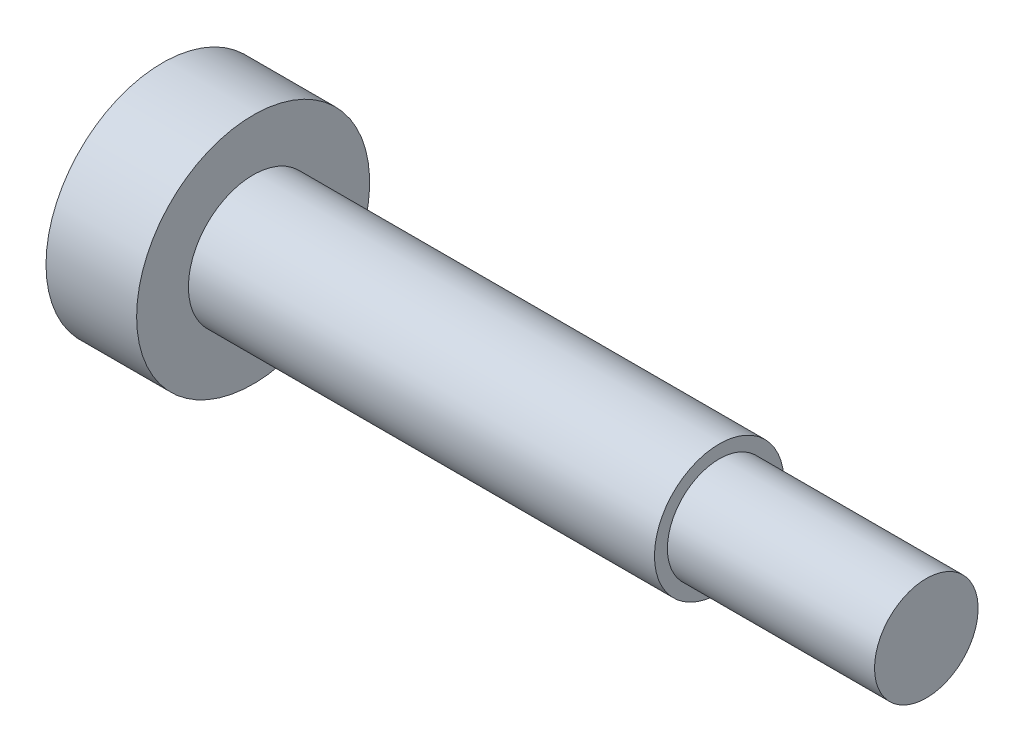
ISO-10303-21;
HEADER;
FILE_DESCRIPTION(('STEP AP214'),'2;1');
FILE_NAME('part.step','',(''),(''),'','','');
FILE_SCHEMA(('AUTOMOTIVE_DESIGN { 1 0 10303 214 1 1 1 1 }'));
ENDSEC;
DATA;
#1=APPLICATION_CONTEXT('core data for automotive mechanical design processes');
#2=APPLICATION_PROTOCOL_DEFINITION('international standard','automotive_design',2000,#1);
#3=PRODUCT_CONTEXT('',#1,'mechanical');
#4=PRODUCT('Part','Part','',(#3));
#5=PRODUCT_RELATED_PRODUCT_CATEGORY('part','',(#4));
#6=PRODUCT_DEFINITION_FORMATION('','',#4);
#7=PRODUCT_DEFINITION_CONTEXT('part definition',#1,'design');
#8=PRODUCT_DEFINITION('design','',#6,#7);
#9=PRODUCT_DEFINITION_SHAPE('','',#8);
#10=(LENGTH_UNIT() NAMED_UNIT(*) SI_UNIT(.MILLI.,.METRE.));
#11=(NAMED_UNIT(*) PLANE_ANGLE_UNIT() SI_UNIT($,.RADIAN.));
#12=(NAMED_UNIT(*) SI_UNIT($,.STERADIAN.) SOLID_ANGLE_UNIT());
#13=UNCERTAINTY_MEASURE_WITH_UNIT(LENGTH_MEASURE(1.E-05),#10,'distance_accuracy_value','');
#14=(GEOMETRIC_REPRESENTATION_CONTEXT(3) GLOBAL_UNCERTAINTY_ASSIGNED_CONTEXT((#13)) GLOBAL_UNIT_ASSIGNED_CONTEXT((#10,
#11,#12)) REPRESENTATION_CONTEXT('',''));
#15=CARTESIAN_POINT('',(0.,0.,0.));
#16=DIRECTION('',(0.,0.,1.));
#17=DIRECTION('',(1.,0.,0.));
#18=AXIS2_PLACEMENT_3D('',#15,#16,#17);
#19=CARTESIAN_POINT('',(0.,0.,0.));
#20=DIRECTION('',(-1.,0.,0.));
#21=DIRECTION('',(0.,0.,1.));
#22=AXIS2_PLACEMENT_3D('',#19,#20,#21);
#23=PLANE('',#22);
#24=CARTESIAN_POINT('',(0.,0.,0.));
#25=DIRECTION('',(-1.,0.,0.));
#26=DIRECTION('',(0.,0.,1.));
#27=AXIS2_PLACEMENT_3D('',#24,#25,#26);
#28=CIRCLE('',#27,2.);
#29=CARTESIAN_POINT('',(0.,0.,2.));
#30=VERTEX_POINT('',#29);
#31=EDGE_CURVE('E10',#30,#30,#28,.T.);
#32=ORIENTED_EDGE('',*,*,#31,.F.);
#33=EDGE_LOOP('',(#32));
#34=FACE_BOUND('',#33,.T.);
#35=ADVANCED_FACE('F39',(#34),#23,.F.);
#36=CARTESIAN_POINT('',(-29.5,0.,0.));
#37=DIRECTION('',(-1.,0.,0.));
#38=DIRECTION('',(0.,0.,1.));
#39=AXIS2_PLACEMENT_3D('',#36,#37,#38);
#40=CYLINDRICAL_SURFACE('',#39,2.);
#41=CARTESIAN_POINT('',(-8.,0.,0.));
#42=DIRECTION('',(-1.,0.,0.));
#43=DIRECTION('',(0.,0.,1.));
#44=AXIS2_PLACEMENT_3D('',#41,#42,#43);
#45=CIRCLE('',#44,2.);
#46=CARTESIAN_POINT('',(-8.,0.,2.));
#47=VERTEX_POINT('',#46);
#48=EDGE_CURVE('E45',#47,#47,#45,.T.);
#49=ORIENTED_EDGE('',*,*,#48,.F.);
#50=EDGE_LOOP('',(#49));
#51=FACE_BOUND('',#50,.T.);
#52=ORIENTED_EDGE('',*,*,#31,.T.);
#53=EDGE_LOOP('',(#52));
#54=FACE_BOUND('',#53,.T.);
#55=ADVANCED_FACE('F87',(#51,#54),#40,.T.);
#56=CARTESIAN_POINT('',(-8.,0.,-2.));
#57=DIRECTION('',(-1.,0.,0.));
#58=DIRECTION('',(0.,0.,1.));
#59=AXIS2_PLACEMENT_3D('',#56,#57,#58);
#60=PLANE('',#59);
#61=CARTESIAN_POINT('',(-8.,0.,0.));
#62=DIRECTION('',(-1.,0.,0.));
#63=DIRECTION('',(0.,0.,1.));
#64=AXIS2_PLACEMENT_3D('',#61,#62,#63);
#65=CIRCLE('',#64,2.5);
#66=CARTESIAN_POINT('',(-8.,0.,2.5));
#67=VERTEX_POINT('',#66);
#68=EDGE_CURVE('E49',#67,#67,#65,.T.);
#69=ORIENTED_EDGE('',*,*,#68,.F.);
#70=EDGE_LOOP('',(#69));
#71=FACE_BOUND('',#70,.T.);
#72=ORIENTED_EDGE('',*,*,#48,.T.);
#73=EDGE_LOOP('',(#72));
#74=FACE_BOUND('',#73,.T.);
#75=ADVANCED_FACE('F82',(#71,#74),#60,.F.);
#76=CARTESIAN_POINT('',(-29.5,0.,0.));
#77=DIRECTION('',(-1.,0.,0.));
#78=DIRECTION('',(0.,0.,1.));
#79=AXIS2_PLACEMENT_3D('',#76,#77,#78);
#80=CYLINDRICAL_SURFACE('',#79,2.5);
#81=CARTESIAN_POINT('',(-26.,0.,0.));
#82=DIRECTION('',(-1.,0.,0.));
#83=DIRECTION('',(0.,0.,1.));
#84=AXIS2_PLACEMENT_3D('',#81,#82,#83);
#85=CIRCLE('',#84,2.5);
#86=CARTESIAN_POINT('',(-26.,0.,2.5));
#87=VERTEX_POINT('',#86);
#88=EDGE_CURVE('E53',#87,#87,#85,.T.);
#89=ORIENTED_EDGE('',*,*,#88,.F.);
#90=EDGE_LOOP('',(#89));
#91=FACE_BOUND('',#90,.T.);
#92=ORIENTED_EDGE('',*,*,#68,.T.);
#93=EDGE_LOOP('',(#92));
#94=FACE_BOUND('',#93,.T.);
#95=ADVANCED_FACE('F76',(#91,#94),#80,.T.);
#96=CARTESIAN_POINT('',(-26.,0.,-2.5));
#97=DIRECTION('',(-1.,0.,0.));
#98=DIRECTION('',(0.,0.,1.));
#99=AXIS2_PLACEMENT_3D('',#96,#97,#98);
#100=PLANE('',#99);
#101=CARTESIAN_POINT('',(-26.,0.,0.));
#102=DIRECTION('',(-1.,0.,0.));
#103=DIRECTION('',(0.,0.,1.));
#104=AXIS2_PLACEMENT_3D('',#101,#102,#103);
#105=CIRCLE('',#104,4.5);
#106=CARTESIAN_POINT('',(-26.,0.,4.5));
#107=VERTEX_POINT('',#106);
#108=EDGE_CURVE('E58',#107,#107,#105,.T.);
#109=ORIENTED_EDGE('',*,*,#108,.F.);
#110=EDGE_LOOP('',(#109));
#111=FACE_BOUND('',#110,.T.);
#112=ORIENTED_EDGE('',*,*,#88,.T.);
#113=EDGE_LOOP('',(#112));
#114=FACE_BOUND('',#113,.T.);
#115=ADVANCED_FACE('F70',(#111,#114),#100,.F.);
#116=CARTESIAN_POINT('',(-29.5,0.,0.));
#117=DIRECTION('',(-1.,0.,0.));
#118=DIRECTION('',(0.,0.,1.));
#119=AXIS2_PLACEMENT_3D('',#116,#117,#118);
#120=CYLINDRICAL_SURFACE('',#119,4.5);
#121=CARTESIAN_POINT('',(-29.5,0.,0.));
#122=DIRECTION('',(-1.,0.,0.));
#123=DIRECTION('',(0.,0.,1.));
#124=AXIS2_PLACEMENT_3D('',#121,#122,#123);
#125=CIRCLE('',#124,4.5);
#126=CARTESIAN_POINT('',(-29.5,0.,4.5));
#127=VERTEX_POINT('',#126);
#128=EDGE_CURVE('E61',#127,#127,#125,.T.);
#129=ORIENTED_EDGE('',*,*,#128,.F.);
#130=EDGE_LOOP('',(#129));
#131=FACE_BOUND('',#130,.T.);
#132=ORIENTED_EDGE('',*,*,#108,.T.);
#133=EDGE_LOOP('',(#132));
#134=FACE_BOUND('',#133,.T.);
#135=ADVANCED_FACE('F67',(#131,#134),#120,.T.);
#136=CARTESIAN_POINT('',(-29.5,0.,-4.5));
#137=DIRECTION('',(1.,0.,0.));
#138=DIRECTION('',(0.,0.,-1.));
#139=AXIS2_PLACEMENT_3D('',#136,#137,#138);
#140=PLANE('',#139);
#141=ORIENTED_EDGE('',*,*,#128,.T.);
#142=EDGE_LOOP('',(#141));
#143=FACE_BOUND('',#142,.T.);
#144=ADVANCED_FACE('F65',(#143),#140,.F.);
#145=CLOSED_SHELL('',(#35,#55,#75,#95,#115,#135,#144));
#146=MANIFOLD_SOLID_BREP('B2',#145);
#147=ADVANCED_BREP_SHAPE_REPRESENTATION('',(#18,#146),#14);
#148=SHAPE_DEFINITION_REPRESENTATION(#9,#147);
ENDSEC;
END-ISO-10303-21;
